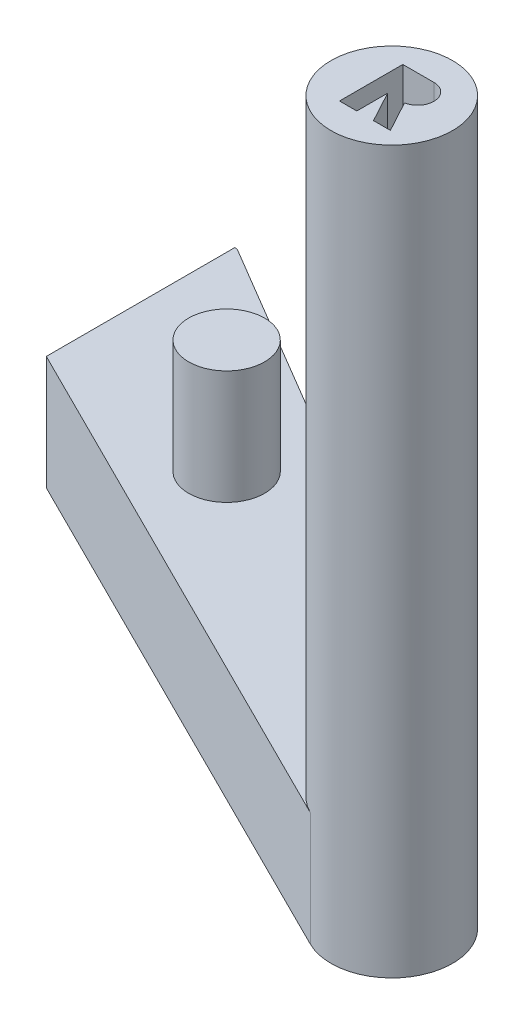
ISO-10303-21;
HEADER;
FILE_DESCRIPTION(('STEP AP214'),'2;1');
FILE_NAME('part.step','',(''),(''),'','','');
FILE_SCHEMA(('AUTOMOTIVE_DESIGN { 1 0 10303 214 1 1 1 1 }'));
ENDSEC;
DATA;
#1=APPLICATION_CONTEXT('core data for automotive mechanical design processes');
#2=APPLICATION_PROTOCOL_DEFINITION('international standard','automotive_design',2000,#1);
#3=PRODUCT_CONTEXT('',#1,'mechanical');
#4=PRODUCT('Part','Part','',(#3));
#5=PRODUCT_RELATED_PRODUCT_CATEGORY('part','',(#4));
#6=PRODUCT_DEFINITION_FORMATION('','',#4);
#7=PRODUCT_DEFINITION_CONTEXT('part definition',#1,'design');
#8=PRODUCT_DEFINITION('design','',#6,#7);
#9=PRODUCT_DEFINITION_SHAPE('','',#8);
#10=(LENGTH_UNIT() NAMED_UNIT(*) SI_UNIT(.MILLI.,.METRE.));
#11=(NAMED_UNIT(*) PLANE_ANGLE_UNIT() SI_UNIT($,.RADIAN.));
#12=(NAMED_UNIT(*) SI_UNIT($,.STERADIAN.) SOLID_ANGLE_UNIT());
#13=UNCERTAINTY_MEASURE_WITH_UNIT(LENGTH_MEASURE(1.E-05),#10,'distance_accuracy_value','');
#14=(GEOMETRIC_REPRESENTATION_CONTEXT(3) GLOBAL_UNCERTAINTY_ASSIGNED_CONTEXT((#13)) GLOBAL_UNIT_ASSIGNED_CONTEXT((#10,
#11,#12)) REPRESENTATION_CONTEXT('',''));
#15=CARTESIAN_POINT('',(0.,0.,0.));
#16=DIRECTION('',(0.,0.,1.));
#17=DIRECTION('',(1.,0.,0.));
#18=AXIS2_PLACEMENT_3D('',#15,#16,#17);
#19=CARTESIAN_POINT('',(0.,95.,0.));
#20=DIRECTION('',(0.,-1.,0.));
#21=DIRECTION('',(0.,0.,-1.));
#22=AXIS2_PLACEMENT_3D('',#19,#20,#21);
#23=CYLINDRICAL_SURFACE('',#22,8.);
#24=CARTESIAN_POINT('',(0.,95.,0.));
#25=DIRECTION('',(0.,1.,0.));
#26=DIRECTION('',(0.,0.,1.));
#27=AXIS2_PLACEMENT_3D('',#24,#25,#26);
#28=CIRCLE('',#27,8.);
#29=CARTESIAN_POINT('',(0.,95.,8.));
#30=VERTEX_POINT('',#29);
#31=EDGE_CURVE('E11',#30,#30,#28,.T.);
#32=ORIENTED_EDGE('',*,*,#31,.F.);
#33=EDGE_LOOP('',(#32));
#34=FACE_BOUND('',#33,.T.);
#35=DIRECTION('',(0.,-1.,0.));
#36=VECTOR('',#35,1.);
#37=CARTESIAN_POINT('',(4.07426175732721,15.,-6.88479419683559));
#38=LINE('',#37,#36);
#39=CARTESIAN_POINT('',(4.07426175732721,15.,-6.88479419683559));
#40=VERTEX_POINT('',#39);
#41=CARTESIAN_POINT('',(4.07426175732721,0.,-6.88479419683559));
#42=VERTEX_POINT('',#41);
#43=EDGE_CURVE('E58',#40,#42,#38,.T.);
#44=ORIENTED_EDGE('',*,*,#43,.F.);
#45=CARTESIAN_POINT('',(0.,15.,0.));
#46=DIRECTION('',(0.,1.,0.));
#47=DIRECTION('',(0.,0.,1.));
#48=AXIS2_PLACEMENT_3D('',#45,#46,#47);
#49=CIRCLE('',#48,8.);
#50=CARTESIAN_POINT('',(-3.57279106032631,15.,7.1578742681925));
#51=VERTEX_POINT('',#50);
#52=EDGE_CURVE('E53',#40,#51,#49,.T.);
#53=ORIENTED_EDGE('',*,*,#52,.T.);
#54=DIRECTION('',(0.,-1.,0.));
#55=VECTOR('',#54,1.);
#56=CARTESIAN_POINT('',(-3.57279106032632,15.,7.15787426819251));
#57=LINE('',#56,#55);
#58=CARTESIAN_POINT('',(-3.57279106032632,0.,7.15787426819251));
#59=VERTEX_POINT('',#58);
#60=EDGE_CURVE('E165',#51,#59,#57,.T.);
#61=ORIENTED_EDGE('',*,*,#60,.T.);
#62=CARTESIAN_POINT('',(0.,0.,0.));
#63=DIRECTION('',(0.,1.,0.));
#64=DIRECTION('',(0.,0.,1.));
#65=AXIS2_PLACEMENT_3D('',#62,#63,#64);
#66=CIRCLE('',#65,8.);
#67=EDGE_CURVE('E42',#59,#42,#66,.T.);
#68=ORIENTED_EDGE('',*,*,#67,.T.);
#69=EDGE_LOOP('',(#44,#53,#61,#68));
#70=FACE_BOUND('',#69,.T.);
#71=ADVANCED_FACE('F39',(#34,#70),#23,.T.);
#72=CARTESIAN_POINT('',(0.,95.,0.));
#73=DIRECTION('',(0.,1.,0.));
#74=DIRECTION('',(0.,0.,1.));
#75=AXIS2_PLACEMENT_3D('',#72,#73,#74);
#76=PLANE('',#75);
#77=ORIENTED_EDGE('',*,*,#31,.T.);
#78=EDGE_LOOP('',(#77));
#79=FACE_BOUND('',#78,.T.);
#80=DIRECTION('',(1.,0.,0.));
#81=VECTOR('',#80,1.);
#82=CARTESIAN_POINT('',(0.,95.,-4.27859742946709));
#83=LINE('',#82,#81);
#84=CARTESIAN_POINT('',(-2.82696370228331,95.,-4.27859742946709));
#85=VERTEX_POINT('',#84);
#86=CARTESIAN_POINT('',(1.2752561078582,95.,-4.27859742946709));
#87=VERTEX_POINT('',#86);
#88=EDGE_CURVE('E210',#85,#87,#83,.T.);
#89=ORIENTED_EDGE('',*,*,#88,.T.);
#90=CARTESIAN_POINT('',(1.2752561078582,95.,-2.1205507819464));
#91=DIRECTION('',(0.,1.,0.));
#92=DIRECTION('',(0.,0.,1.));
#93=AXIS2_PLACEMENT_3D('',#90,#91,#92);
#94=CIRCLE('',#93,2.15804664752069);
#95=CARTESIAN_POINT('',(1.6757928902663,95.,0.));
#96=VERTEX_POINT('',#95);
#97=EDGE_CURVE('E184',#87,#96,#94,.F.);
#98=ORIENTED_EDGE('',*,*,#97,.T.);
#99=DIRECTION('',(0.476392179300963,0.,0.879232899464573));
#100=VECTOR('',#99,1.);
#101=CARTESIAN_POINT('',(1.29547251747404,95.,-0.701922068885038));
#102=LINE('',#101,#100);
#103=CARTESIAN_POINT('',(3.8771620750215,95.,4.06286310985283));
#104=VERTEX_POINT('',#103);
#105=EDGE_CURVE('E189',#96,#104,#102,.T.);
#106=ORIENTED_EDGE('',*,*,#105,.T.);
#107=DIRECTION('',(1.,0.,0.));
#108=VECTOR('',#107,1.);
#109=CARTESIAN_POINT('',(0.,95.,4.06286310985283));
#110=LINE('',#109,#108);
#111=CARTESIAN_POINT('',(1.65372068123101,95.,4.06286310985283));
#112=VERTEX_POINT('',#111);
#113=EDGE_CURVE('E225',#112,#104,#110,.T.);
#114=ORIENTED_EDGE('',*,*,#113,.F.);
#115=DIRECTION('',(0.476392179300963,0.,0.879232899464573));
#116=VECTOR('',#115,1.);
#117=CARTESIAN_POINT('',(-0.423359944819093,95.,0.229387875344432));
#118=LINE('',#117,#116);
#119=CARTESIAN_POINT('',(-0.547648503524186,95.,0.));
#120=VERTEX_POINT('',#119);
#121=EDGE_CURVE('E222',#120,#112,#118,.T.);
#122=ORIENTED_EDGE('',*,*,#121,.F.);
#123=DIRECTION('',(0.,0.,1.));
#124=VECTOR('',#123,1.);
#125=CARTESIAN_POINT('',(-0.547648503524186,95.,0.));
#126=LINE('',#125,#124);
#127=CARTESIAN_POINT('',(-0.547648503524186,95.,4.06286310985283));
#128=VERTEX_POINT('',#127);
#129=EDGE_CURVE('E219',#120,#128,#126,.T.);
#130=ORIENTED_EDGE('',*,*,#129,.T.);
#131=DIRECTION('',(1.,0.,0.));
#132=VECTOR('',#131,1.);
#133=CARTESIAN_POINT('',(0.,95.,4.06286310985283));
#134=LINE('',#133,#132);
#135=CARTESIAN_POINT('',(-2.82696370228331,95.,4.06286310985283));
#136=VERTEX_POINT('',#135);
#137=EDGE_CURVE('E216',#136,#128,#134,.T.);
#138=ORIENTED_EDGE('',*,*,#137,.F.);
#139=DIRECTION('',(0.,0.,1.));
#140=VECTOR('',#139,1.);
#141=CARTESIAN_POINT('',(-2.82696370228331,95.,0.));
#142=LINE('',#141,#140);
#143=EDGE_CURVE('E213',#85,#136,#142,.T.);
#144=ORIENTED_EDGE('',*,*,#143,.F.);
#145=EDGE_LOOP('',(#89,#98,#106,#114,#122,#130,#138,#144));
#146=FACE_BOUND('',#145,.T.);
#147=ADVANCED_FACE('F285',(#79,#146),#76,.T.);
#148=CARTESIAN_POINT('',(0.,0.,0.));
#149=DIRECTION('',(0.,1.,0.));
#150=DIRECTION('',(0.,0.,1.));
#151=AXIS2_PLACEMENT_3D('',#148,#149,#150);
#152=PLANE('',#151);
#153=CARTESIAN_POINT('',(0.,0.,0.));
#154=DIRECTION('',(0.,-1.,0.));
#155=DIRECTION('',(0.,0.,-1.));
#156=AXIS2_PLACEMENT_3D('',#153,#154,#155);
#157=CIRCLE('',#156,4.);
#158=CARTESIAN_POINT('',(0.,0.,-4.));
#159=VERTEX_POINT('',#158);
#160=EDGE_CURVE('E233',#159,#159,#157,.T.);
#161=ORIENTED_EDGE('',*,*,#160,.F.);
#162=EDGE_LOOP('',(#161));
#163=FACE_BOUND('',#162,.T.);
#164=ORIENTED_EDGE('',*,*,#67,.F.);
#165=DIRECTION('',(0.894735513611201,0.,0.446596418125919));
#166=VECTOR('',#165,1.);
#167=CARTESIAN_POINT('',(-3.57277134499381,0.,7.15788410886246));
#168=LINE('',#167,#166);
#169=CARTESIAN_POINT('',(-73.0017361381057,0.,-27.4967445709018));
#170=VERTEX_POINT('',#169);
#171=EDGE_CURVE('E156',#170,#59,#168,.T.);
#172=ORIENTED_EDGE('',*,*,#171,.F.);
#173=DIRECTION('',(0.,0.,1.));
#174=VECTOR('',#173,1.);
#175=CARTESIAN_POINT('',(-73.0017361381057,0.,0.));
#176=LINE('',#175,#174);
#177=CARTESIAN_POINT('',(-73.0017361381057,0.,-52.3357072501549));
#178=VERTEX_POINT('',#177);
#179=EDGE_CURVE('E170',#178,#170,#176,.T.);
#180=ORIENTED_EDGE('',*,*,#179,.F.);
#181=CARTESIAN_POINT('',(-75.0017361381057,0.,-39.9967445709018));
#182=DIRECTION('',(0.,1.,0.));
#183=DIRECTION('',(0.,0.,1.));
#184=AXIS2_PLACEMENT_3D('',#181,#182,#183);
#185=CIRCLE('',#184,12.5);
#186=CARTESIAN_POINT('',(-72.6121958670346,0.,-52.2662228521055));
#187=VERTEX_POINT('',#186);
#188=EDGE_CURVE('E168',#187,#178,#185,.T.);
#189=ORIENTED_EDGE('',*,*,#188,.F.);
#190=DIRECTION('',(0.86059849228556,0.,0.509284041646526));
#191=VECTOR('',#190,1.);
#192=CARTESIAN_POINT('',(4.0742723331674,0.,-6.88478793827636));
#193=LINE('',#192,#191);
#194=EDGE_CURVE('E151',#187,#42,#193,.T.);
#195=ORIENTED_EDGE('',*,*,#194,.T.);
#196=EDGE_LOOP('',(#164,#172,#180,#189,#195));
#197=FACE_BOUND('',#196,.T.);
#198=ADVANCED_FACE('F259',(#163,#197),#152,.F.);
#199=CARTESIAN_POINT('',(0.,45.,0.));
#200=DIRECTION('',(0.,-1.,0.));
#201=DIRECTION('',(0.,0.,-1.));
#202=AXIS2_PLACEMENT_3D('',#199,#200,#201);
#203=CYLINDRICAL_SURFACE('',#202,4.);
#204=CARTESIAN_POINT('',(0.,45.,0.));
#205=DIRECTION('',(0.,1.,0.));
#206=DIRECTION('',(0.,0.,1.));
#207=AXIS2_PLACEMENT_3D('',#204,#205,#206);
#208=CIRCLE('',#207,4.);
#209=CARTESIAN_POINT('',(0.,45.,-4.));
#210=VERTEX_POINT('',#209);
#211=EDGE_CURVE('E142',#210,#210,#208,.F.);
#212=CARTESIAN_POINT('',(0.,45.,-4.));
#213=CARTESIAN_POINT('',(0.,44.53125,-4.));
#214=CARTESIAN_POINT('',(0.,44.0625,-4.));
#215=CARTESIAN_POINT('',(0.,43.125,-4.));
#216=CARTESIAN_POINT('',(0.,42.65625,-4.));
#217=CARTESIAN_POINT('',(0.,41.71875,-4.));
#218=CARTESIAN_POINT('',(0.,41.25,-4.));
#219=CARTESIAN_POINT('',(0.,40.3125,-4.));
#220=CARTESIAN_POINT('',(0.,39.84375,-4.));
#221=CARTESIAN_POINT('',(0.,38.90625,-4.));
#222=CARTESIAN_POINT('',(0.,38.4375,-4.));
#223=CARTESIAN_POINT('',(0.,37.5,-4.));
#224=CARTESIAN_POINT('',(0.,37.03125,-4.));
#225=CARTESIAN_POINT('',(0.,36.09375,-4.));
#226=CARTESIAN_POINT('',(0.,35.625,-4.));
#227=CARTESIAN_POINT('',(0.,34.6875,-4.));
#228=CARTESIAN_POINT('',(0.,34.21875,-4.));
#229=CARTESIAN_POINT('',(0.,33.28125,-4.));
#230=CARTESIAN_POINT('',(0.,32.8125,-4.));
#231=CARTESIAN_POINT('',(0.,31.875,-4.));
#232=CARTESIAN_POINT('',(0.,31.40625,-4.));
#233=CARTESIAN_POINT('',(0.,30.46875,-4.));
#234=CARTESIAN_POINT('',(0.,30.,-4.));
#235=CARTESIAN_POINT('',(0.,29.0625,-4.));
#236=CARTESIAN_POINT('',(0.,28.59375,-4.));
#237=CARTESIAN_POINT('',(0.,27.65625,-4.));
#238=CARTESIAN_POINT('',(0.,27.1875,-4.));
#239=CARTESIAN_POINT('',(0.,26.25,-4.));
#240=CARTESIAN_POINT('',(0.,25.78125,-4.));
#241=CARTESIAN_POINT('',(0.,24.84375,-4.));
#242=CARTESIAN_POINT('',(0.,24.375,-4.));
#243=CARTESIAN_POINT('',(0.,23.4375,-4.));
#244=CARTESIAN_POINT('',(0.,22.96875,-4.));
#245=CARTESIAN_POINT('',(0.,22.03125,-4.));
#246=CARTESIAN_POINT('',(0.,21.5625,-4.));
#247=CARTESIAN_POINT('',(0.,20.625,-4.));
#248=CARTESIAN_POINT('',(0.,20.15625,-4.));
#249=CARTESIAN_POINT('',(0.,19.21875,-4.));
#250=CARTESIAN_POINT('',(0.,18.75,-4.));
#251=CARTESIAN_POINT('',(0.,17.8125,-4.));
#252=CARTESIAN_POINT('',(0.,17.34375,-4.));
#253=CARTESIAN_POINT('',(0.,16.40625,-4.));
#254=CARTESIAN_POINT('',(0.,15.9375,-4.));
#255=CARTESIAN_POINT('',(0.,15.,-4.));
#256=CARTESIAN_POINT('',(0.,14.53125,-4.));
#257=CARTESIAN_POINT('',(0.,13.59375,-4.));
#258=CARTESIAN_POINT('',(0.,13.125,-4.));
#259=CARTESIAN_POINT('',(0.,12.1875,-4.));
#260=CARTESIAN_POINT('',(0.,11.71875,-4.));
#261=CARTESIAN_POINT('',(0.,10.78125,-4.));
#262=CARTESIAN_POINT('',(0.,10.3125,-4.));
#263=CARTESIAN_POINT('',(0.,9.37500000000001,-4.));
#264=CARTESIAN_POINT('',(0.,8.90625000000001,-4.));
#265=CARTESIAN_POINT('',(0.,7.96875000000001,-4.));
#266=CARTESIAN_POINT('',(0.,7.5,-4.));
#267=CARTESIAN_POINT('',(0.,6.5625,-4.));
#268=CARTESIAN_POINT('',(0.,6.09375,-4.));
#269=CARTESIAN_POINT('',(0.,5.15625000000001,-4.));
#270=CARTESIAN_POINT('',(0.,4.68750000000001,-4.));
#271=CARTESIAN_POINT('',(0.,3.75000000000001,-4.));
#272=CARTESIAN_POINT('',(0.,3.28125000000001,-4.));
#273=CARTESIAN_POINT('',(0.,2.34375000000001,-4.));
#274=CARTESIAN_POINT('',(0.,1.87500000000001,-4.));
#275=CARTESIAN_POINT('',(0.,0.937500000000006,-4.));
#276=CARTESIAN_POINT('',(0.,0.468750000000007,-4.));
#277=CARTESIAN_POINT('',(0.,0.,-4.));
#278=B_SPLINE_CURVE_WITH_KNOTS('',3,(#212,#213,#214,#215,#216,#217,#218,#219,#220,#221,#222,
#223,#224,#225,#226,#227,#228,#229,#230,#231,#232,#233,#234,#235,#236,#237,#238,#239,#240,#241,
#242,#243,#244,#245,#246,#247,#248,#249,#250,#251,#252,#253,#254,#255,#256,#257,#258,#259,#260,
#261,#262,#263,#264,#265,#266,#267,#268,#269,#270,#271,#272,#273,#274,#275,#276,#277),
.UNSPECIFIED.,.F.,.F.,(4,2,2,2,2,2,2,2,2,2,2,2,2,2,2,2,2,2,2,2,2,2,2,2,2,2,2,2,2,2,2,2,4),(0.,
1.40625,2.8125,4.21874999999999,5.625,7.03125,8.43749999999999,9.84374999999999,11.25,12.65625,
14.0625,15.46875,16.875,18.28125,19.6875,21.09375,22.5,23.90625,25.3125,26.71875,28.125,
29.53125,30.9375,32.34375,33.75,35.15625,36.5625,37.96875,39.375,40.78125,42.1875,43.59375,45.),.UNSPECIFIED.);
#279=EDGE_CURVE('BSEAM341',#210,#159,#278,.T.);
#280=ORIENTED_EDGE('',*,*,#211,.F.);
#281=ORIENTED_EDGE('',*,*,#160,.T.);
#282=ORIENTED_EDGE('',*,*,#279,.T.);
#283=ORIENTED_EDGE('',*,*,#279,.F.);
#284=EDGE_LOOP('',(#280,#282,#281,#283));
#285=FACE_BOUND('',#284,.T.);
#286=ADVANCED_FACE('F341',(#285),#203,.F.);
#287=CARTESIAN_POINT('',(1.2752561078582,55.,-2.1205507819464));
#288=DIRECTION('',(0.,1.,0.));
#289=DIRECTION('',(0.,0.,1.));
#290=AXIS2_PLACEMENT_3D('',#287,#288,#289);
#291=CYLINDRICAL_SURFACE('',#290,2.15804664752069);
#292=ORIENTED_EDGE('',*,*,#97,.F.);
#293=DIRECTION('',(0.,1.,0.));
#294=VECTOR('',#293,1.);
#295=CARTESIAN_POINT('',(1.2752561078582,55.,-4.27859742946709));
#296=LINE('',#295,#294);
#297=CARTESIAN_POINT('',(1.2752561078582,55.,-4.27859742946709));
#298=VERTEX_POINT('',#297);
#299=EDGE_CURVE('E207',#298,#87,#296,.T.);
#300=ORIENTED_EDGE('',*,*,#299,.F.);
#301=CARTESIAN_POINT('',(1.2752561078582,55.,-2.1205507819464));
#302=DIRECTION('',(0.,1.,0.));
#303=DIRECTION('',(0.,0.,1.));
#304=AXIS2_PLACEMENT_3D('',#301,#302,#303);
#305=CIRCLE('',#304,2.15804664752069);
#306=CARTESIAN_POINT('',(1.6757928902663,55.,0.));
#307=VERTEX_POINT('',#306);
#308=EDGE_CURVE('E185',#298,#307,#305,.F.);
#309=ORIENTED_EDGE('',*,*,#308,.T.);
#310=DIRECTION('',(0.,1.,0.));
#311=VECTOR('',#310,1.);
#312=CARTESIAN_POINT('',(1.6757928902663,55.,0.));
#313=LINE('',#312,#311);
#314=EDGE_CURVE('E230',#307,#96,#313,.T.);
#315=ORIENTED_EDGE('',*,*,#314,.T.);
#316=EDGE_LOOP('',(#292,#300,#309,#315));
#317=FACE_BOUND('',#316,.T.);
#318=ADVANCED_FACE('F303',(#317),#291,.F.);
#319=CARTESIAN_POINT('',(1.29547251747404,55.,-0.701922068885038));
#320=DIRECTION('',(-0.879232899464573,0.,0.476392179300963));
#321=DIRECTION('',(0.476392179300963,0.,0.879232899464573));
#322=AXIS2_PLACEMENT_3D('',#319,#320,#321);
#323=PLANE('',#322);
#324=ORIENTED_EDGE('',*,*,#105,.F.);
#325=ORIENTED_EDGE('',*,*,#314,.F.);
#326=DIRECTION('',(0.476392179300963,0.,0.879232899464573));
#327=VECTOR('',#326,1.);
#328=CARTESIAN_POINT('',(1.29547251747404,55.,-0.701922068885038));
#329=LINE('',#328,#327);
#330=CARTESIAN_POINT('',(3.8771620750215,55.,4.06286310985283));
#331=VERTEX_POINT('',#330);
#332=EDGE_CURVE('E205',#307,#331,#329,.T.);
#333=ORIENTED_EDGE('',*,*,#332,.T.);
#334=DIRECTION('',(0.,1.,0.));
#335=VECTOR('',#334,1.);
#336=CARTESIAN_POINT('',(3.8771620750215,55.,4.06286310985283));
#337=LINE('',#336,#335);
#338=EDGE_CURVE('E234',#331,#104,#337,.T.);
#339=ORIENTED_EDGE('',*,*,#338,.T.);
#340=EDGE_LOOP('',(#324,#325,#333,#339));
#341=FACE_BOUND('',#340,.T.);
#342=ADVANCED_FACE('F311',(#341),#323,.T.);
#343=CARTESIAN_POINT('',(0.,55.,4.06286310985283));
#344=DIRECTION('',(0.,0.,1.));
#345=DIRECTION('',(1.,0.,0.));
#346=AXIS2_PLACEMENT_3D('',#343,#344,#345);
#347=PLANE('',#346);
#348=ORIENTED_EDGE('',*,*,#113,.T.);
#349=ORIENTED_EDGE('',*,*,#338,.F.);
#350=DIRECTION('',(1.,0.,0.));
#351=VECTOR('',#350,1.);
#352=CARTESIAN_POINT('',(0.,55.,4.06286310985283));
#353=LINE('',#352,#351);
#354=CARTESIAN_POINT('',(1.65372068123101,55.,4.06286310985283));
#355=VERTEX_POINT('',#354);
#356=EDGE_CURVE('E202',#355,#331,#353,.T.);
#357=ORIENTED_EDGE('',*,*,#356,.F.);
#358=DIRECTION('',(0.,1.,0.));
#359=VECTOR('',#358,1.);
#360=CARTESIAN_POINT('',(1.65372068123101,55.,4.06286310985283));
#361=LINE('',#360,#359);
#362=EDGE_CURVE('E236',#355,#112,#361,.T.);
#363=ORIENTED_EDGE('',*,*,#362,.T.);
#364=EDGE_LOOP('',(#348,#349,#357,#363));
#365=FACE_BOUND('',#364,.T.);
#366=ADVANCED_FACE('F313',(#365),#347,.F.);
#367=CARTESIAN_POINT('',(-0.423359944819093,55.,0.229387875344432));
#368=DIRECTION('',(-0.879232899464573,0.,0.476392179300963));
#369=DIRECTION('',(0.476392179300963,0.,0.879232899464573));
#370=AXIS2_PLACEMENT_3D('',#367,#368,#369);
#371=PLANE('',#370);
#372=ORIENTED_EDGE('',*,*,#121,.T.);
#373=ORIENTED_EDGE('',*,*,#362,.F.);
#374=DIRECTION('',(0.476392179300963,0.,0.879232899464573));
#375=VECTOR('',#374,1.);
#376=CARTESIAN_POINT('',(-0.423359944819093,55.,0.229387875344432));
#377=LINE('',#376,#375);
#378=CARTESIAN_POINT('',(-0.547648503524186,55.,0.));
#379=VERTEX_POINT('',#378);
#380=EDGE_CURVE('E199',#379,#355,#377,.T.);
#381=ORIENTED_EDGE('',*,*,#380,.F.);
#382=DIRECTION('',(0.,1.,0.));
#383=VECTOR('',#382,1.);
#384=CARTESIAN_POINT('',(-0.547648503524186,55.,0.));
#385=LINE('',#384,#383);
#386=EDGE_CURVE('E238',#379,#120,#385,.T.);
#387=ORIENTED_EDGE('',*,*,#386,.T.);
#388=EDGE_LOOP('',(#372,#373,#381,#387));
#389=FACE_BOUND('',#388,.T.);
#390=ADVANCED_FACE('F318',(#389),#371,.F.);
#391=CARTESIAN_POINT('',(-0.547648503524186,55.,0.));
#392=DIRECTION('',(-1.,0.,0.));
#393=DIRECTION('',(0.,0.,1.));
#394=AXIS2_PLACEMENT_3D('',#391,#392,#393);
#395=PLANE('',#394);
#396=ORIENTED_EDGE('',*,*,#129,.F.);
#397=ORIENTED_EDGE('',*,*,#386,.F.);
#398=DIRECTION('',(0.,0.,1.));
#399=VECTOR('',#398,1.);
#400=CARTESIAN_POINT('',(-0.547648503524186,55.,0.));
#401=LINE('',#400,#399);
#402=CARTESIAN_POINT('',(-0.547648503524186,55.,4.06286310985283));
#403=VERTEX_POINT('',#402);
#404=EDGE_CURVE('E197',#379,#403,#401,.T.);
#405=ORIENTED_EDGE('',*,*,#404,.T.);
#406=DIRECTION('',(0.,1.,0.));
#407=VECTOR('',#406,1.);
#408=CARTESIAN_POINT('',(-0.547648503524186,55.,4.06286310985283));
#409=LINE('',#408,#407);
#410=EDGE_CURVE('E240',#403,#128,#409,.T.);
#411=ORIENTED_EDGE('',*,*,#410,.T.);
#412=EDGE_LOOP('',(#396,#397,#405,#411));
#413=FACE_BOUND('',#412,.T.);
#414=ADVANCED_FACE('F322',(#413),#395,.T.);
#415=CARTESIAN_POINT('',(0.,55.,4.06286310985283));
#416=DIRECTION('',(0.,0.,1.));
#417=DIRECTION('',(1.,0.,0.));
#418=AXIS2_PLACEMENT_3D('',#415,#416,#417);
#419=PLANE('',#418);
#420=ORIENTED_EDGE('',*,*,#137,.T.);
#421=ORIENTED_EDGE('',*,*,#410,.F.);
#422=DIRECTION('',(1.,0.,0.));
#423=VECTOR('',#422,1.);
#424=CARTESIAN_POINT('',(0.,55.,4.06286310985283));
#425=LINE('',#424,#423);
#426=CARTESIAN_POINT('',(-2.82696370228331,55.,4.06286310985283));
#427=VERTEX_POINT('',#426);
#428=EDGE_CURVE('E194',#427,#403,#425,.T.);
#429=ORIENTED_EDGE('',*,*,#428,.F.);
#430=DIRECTION('',(0.,1.,0.));
#431=VECTOR('',#430,1.);
#432=CARTESIAN_POINT('',(-2.82696370228331,55.,4.06286310985283));
#433=LINE('',#432,#431);
#434=EDGE_CURVE('E242',#427,#136,#433,.T.);
#435=ORIENTED_EDGE('',*,*,#434,.T.);
#436=EDGE_LOOP('',(#420,#421,#429,#435));
#437=FACE_BOUND('',#436,.T.);
#438=ADVANCED_FACE('F326',(#437),#419,.F.);
#439=CARTESIAN_POINT('',(-2.82696370228331,55.,0.));
#440=DIRECTION('',(-1.,0.,0.));
#441=DIRECTION('',(0.,0.,1.));
#442=AXIS2_PLACEMENT_3D('',#439,#440,#441);
#443=PLANE('',#442);
#444=ORIENTED_EDGE('',*,*,#143,.T.);
#445=ORIENTED_EDGE('',*,*,#434,.F.);
#446=DIRECTION('',(0.,0.,1.));
#447=VECTOR('',#446,1.);
#448=CARTESIAN_POINT('',(-2.82696370228331,55.,0.));
#449=LINE('',#448,#447);
#450=CARTESIAN_POINT('',(-2.82696370228331,55.,-4.27859742946709));
#451=VERTEX_POINT('',#450);
#452=EDGE_CURVE('E191',#451,#427,#449,.T.);
#453=ORIENTED_EDGE('',*,*,#452,.F.);
#454=DIRECTION('',(0.,1.,0.));
#455=VECTOR('',#454,1.);
#456=CARTESIAN_POINT('',(-2.82696370228331,55.,-4.27859742946709));
#457=LINE('',#456,#455);
#458=EDGE_CURVE('E244',#451,#85,#457,.T.);
#459=ORIENTED_EDGE('',*,*,#458,.T.);
#460=EDGE_LOOP('',(#444,#445,#453,#459));
#461=FACE_BOUND('',#460,.T.);
#462=ADVANCED_FACE('F328',(#461),#443,.F.);
#463=CARTESIAN_POINT('',(0.,55.,-4.27859742946709));
#464=DIRECTION('',(0.,0.,1.));
#465=DIRECTION('',(1.,0.,0.));
#466=AXIS2_PLACEMENT_3D('',#463,#464,#465);
#467=PLANE('',#466);
#468=ORIENTED_EDGE('',*,*,#88,.F.);
#469=ORIENTED_EDGE('',*,*,#458,.F.);
#470=DIRECTION('',(1.,0.,0.));
#471=VECTOR('',#470,1.);
#472=CARTESIAN_POINT('',(0.,55.,-4.27859742946709));
#473=LINE('',#472,#471);
#474=EDGE_CURVE('E188',#451,#298,#473,.T.);
#475=ORIENTED_EDGE('',*,*,#474,.T.);
#476=ORIENTED_EDGE('',*,*,#299,.T.);
#477=EDGE_LOOP('',(#468,#469,#475,#476));
#478=FACE_BOUND('',#477,.T.);
#479=ADVANCED_FACE('F298',(#478),#467,.T.);
#480=CARTESIAN_POINT('',(0.,55.,0.));
#481=DIRECTION('',(0.,1.,0.));
#482=DIRECTION('',(0.,0.,1.));
#483=AXIS2_PLACEMENT_3D('',#480,#481,#482);
#484=PLANE('',#483);
#485=ORIENTED_EDGE('',*,*,#308,.F.);
#486=ORIENTED_EDGE('',*,*,#474,.F.);
#487=ORIENTED_EDGE('',*,*,#452,.T.);
#488=ORIENTED_EDGE('',*,*,#428,.T.);
#489=ORIENTED_EDGE('',*,*,#404,.F.);
#490=ORIENTED_EDGE('',*,*,#380,.T.);
#491=ORIENTED_EDGE('',*,*,#356,.T.);
#492=ORIENTED_EDGE('',*,*,#332,.F.);
#493=EDGE_LOOP('',(#485,#486,#487,#488,#489,#490,#491,#492));
#494=FACE_BOUND('',#493,.T.);
#495=ADVANCED_FACE('F306',(#494),#484,.T.);
#496=CARTESIAN_POINT('',(4.0742723331674,15.,-6.88478793827636));
#497=DIRECTION('',(0.509284041646526,0.,-0.86059849228556));
#498=DIRECTION('',(-0.86059849228556,0.,-0.509284041646526));
#499=AXIS2_PLACEMENT_3D('',#496,#497,#498);
#500=PLANE('',#499);
#501=ORIENTED_EDGE('',*,*,#194,.F.);
#502=DIRECTION('',(0.,-1.,0.));
#503=VECTOR('',#502,1.);
#504=CARTESIAN_POINT('',(-72.6121958670346,15.,-52.2662228521055));
#505=LINE('',#504,#503);
#506=CARTESIAN_POINT('',(-72.6121958670346,15.,-52.2662228521055));
#507=VERTEX_POINT('',#506);
#508=EDGE_CURVE('E181',#507,#187,#505,.T.);
#509=ORIENTED_EDGE('',*,*,#508,.F.);
#510=DIRECTION('',(0.86059849228556,0.,0.509284041646526));
#511=VECTOR('',#510,1.);
#512=CARTESIAN_POINT('',(4.0742723331674,15.,-6.88478793827636));
#513=LINE('',#512,#511);
#514=EDGE_CURVE('E155',#507,#40,#513,.T.);
#515=ORIENTED_EDGE('',*,*,#514,.T.);
#516=ORIENTED_EDGE('',*,*,#43,.T.);
#517=EDGE_LOOP('',(#501,#509,#515,#516));
#518=FACE_BOUND('',#517,.T.);
#519=ADVANCED_FACE('F256',(#518),#500,.T.);
#520=CARTESIAN_POINT('',(-75.0017361381057,15.,-39.9967445709018));
#521=DIRECTION('',(0.,-1.,0.));
#522=DIRECTION('',(0.,0.,-1.));
#523=AXIS2_PLACEMENT_3D('',#520,#521,#522);
#524=CYLINDRICAL_SURFACE('',#523,12.5);
#525=ORIENTED_EDGE('',*,*,#188,.T.);
#526=DIRECTION('',(0.,-1.,0.));
#527=VECTOR('',#526,1.);
#528=CARTESIAN_POINT('',(-73.0017361381057,15.,-52.3357072501549));
#529=LINE('',#528,#527);
#530=CARTESIAN_POINT('',(-73.0017361381057,15.,-52.3357072501549));
#531=VERTEX_POINT('',#530);
#532=EDGE_CURVE('E178',#531,#178,#529,.T.);
#533=ORIENTED_EDGE('',*,*,#532,.F.);
#534=CARTESIAN_POINT('',(-75.0017361381057,15.,-39.9967445709018));
#535=DIRECTION('',(0.,1.,0.));
#536=DIRECTION('',(0.,0.,1.));
#537=AXIS2_PLACEMENT_3D('',#534,#535,#536);
#538=CIRCLE('',#537,12.5);
#539=EDGE_CURVE('E159',#507,#531,#538,.T.);
#540=ORIENTED_EDGE('',*,*,#539,.F.);
#541=ORIENTED_EDGE('',*,*,#508,.T.);
#542=EDGE_LOOP('',(#525,#533,#540,#541));
#543=FACE_BOUND('',#542,.T.);
#544=ADVANCED_FACE('F263',(#543),#524,.T.);
#545=CARTESIAN_POINT('',(-73.0017361381057,15.,0.));
#546=DIRECTION('',(1.,0.,0.));
#547=DIRECTION('',(0.,0.,-1.));
#548=AXIS2_PLACEMENT_3D('',#545,#546,#547);
#549=PLANE('',#548);
#550=ORIENTED_EDGE('',*,*,#179,.T.);
#551=DIRECTION('',(0.,-1.,0.));
#552=VECTOR('',#551,1.);
#553=CARTESIAN_POINT('',(-73.0017361381057,15.,-27.4967445709018));
#554=LINE('',#553,#552);
#555=CARTESIAN_POINT('',(-73.0017361381057,15.,-27.4967445709018));
#556=VERTEX_POINT('',#555);
#557=EDGE_CURVE('E175',#556,#170,#554,.T.);
#558=ORIENTED_EDGE('',*,*,#557,.F.);
#559=DIRECTION('',(0.,0.,1.));
#560=VECTOR('',#559,1.);
#561=CARTESIAN_POINT('',(-73.0017361381057,15.,0.));
#562=LINE('',#561,#560);
#563=EDGE_CURVE('E161',#531,#556,#562,.T.);
#564=ORIENTED_EDGE('',*,*,#563,.F.);
#565=ORIENTED_EDGE('',*,*,#532,.T.);
#566=EDGE_LOOP('',(#550,#558,#564,#565));
#567=FACE_BOUND('',#566,.T.);
#568=ADVANCED_FACE('F267',(#567),#549,.F.);
#569=CARTESIAN_POINT('',(-3.57277134499381,15.,7.15788410886246));
#570=DIRECTION('',(0.446596418125919,0.,-0.894735513611201));
#571=DIRECTION('',(-0.894735513611201,0.,-0.446596418125919));
#572=AXIS2_PLACEMENT_3D('',#569,#570,#571);
#573=PLANE('',#572);
#574=ORIENTED_EDGE('',*,*,#171,.T.);
#575=ORIENTED_EDGE('',*,*,#60,.F.);
#576=DIRECTION('',(0.894735513611201,0.,0.446596418125919));
#577=VECTOR('',#576,1.);
#578=CARTESIAN_POINT('',(-3.57277134499381,15.,7.15788410886246));
#579=LINE('',#578,#577);
#580=EDGE_CURVE('E163',#556,#51,#579,.T.);
#581=ORIENTED_EDGE('',*,*,#580,.F.);
#582=ORIENTED_EDGE('',*,*,#557,.T.);
#583=EDGE_LOOP('',(#574,#575,#581,#582));
#584=FACE_BOUND('',#583,.T.);
#585=ADVANCED_FACE('F273',(#584),#573,.F.);
#586=CARTESIAN_POINT('',(0.,15.,0.));
#587=DIRECTION('',(0.,1.,0.));
#588=DIRECTION('',(0.,0.,1.));
#589=AXIS2_PLACEMENT_3D('',#586,#587,#588);
#590=PLANE('',#589);
#591=CARTESIAN_POINT('',(-48.0017361381057,15.,-26.2466106307581));
#592=DIRECTION('',(0.,1.,0.));
#593=DIRECTION('',(0.,0.,1.));
#594=AXIS2_PLACEMENT_3D('',#591,#592,#593);
#595=CIRCLE('',#594,5.);
#596=CARTESIAN_POINT('',(-48.0017361381057,15.,-21.2466106307581));
#597=VERTEX_POINT('',#596);
#598=EDGE_CURVE('E145',#597,#597,#595,.T.);
#599=ORIENTED_EDGE('',*,*,#598,.F.);
#600=EDGE_LOOP('',(#599));
#601=FACE_BOUND('',#600,.T.);
#602=ORIENTED_EDGE('',*,*,#52,.F.);
#603=ORIENTED_EDGE('',*,*,#514,.F.);
#604=ORIENTED_EDGE('',*,*,#539,.T.);
#605=ORIENTED_EDGE('',*,*,#563,.T.);
#606=ORIENTED_EDGE('',*,*,#580,.T.);
#607=EDGE_LOOP('',(#602,#603,#604,#605,#606));
#608=FACE_BOUND('',#607,.T.);
#609=ADVANCED_FACE('F271',(#601,#608),#590,.T.);
#610=CARTESIAN_POINT('',(-48.0017361381057,30.,-26.2466106307581));
#611=DIRECTION('',(0.,-1.,0.));
#612=DIRECTION('',(0.,0.,-1.));
#613=AXIS2_PLACEMENT_3D('',#610,#611,#612);
#614=CYLINDRICAL_SURFACE('',#613,5.);
#615=CARTESIAN_POINT('',(-48.0017361381057,30.,-26.2466106307581));
#616=DIRECTION('',(0.,1.,0.));
#617=DIRECTION('',(0.,0.,1.));
#618=AXIS2_PLACEMENT_3D('',#615,#616,#617);
#619=CIRCLE('',#618,5.);
#620=CARTESIAN_POINT('',(-48.0017361381057,30.,-21.2466106307581));
#621=VERTEX_POINT('',#620);
#622=EDGE_CURVE('E148',#621,#621,#619,.T.);
#623=ORIENTED_EDGE('',*,*,#622,.F.);
#624=EDGE_LOOP('',(#623));
#625=FACE_BOUND('',#624,.T.);
#626=ORIENTED_EDGE('',*,*,#598,.T.);
#627=EDGE_LOOP('',(#626));
#628=FACE_BOUND('',#627,.T.);
#629=ADVANCED_FACE('F280',(#625,#628),#614,.T.);
#630=CARTESIAN_POINT('',(-48.0017361381057,30.,-26.2466106307581));
#631=DIRECTION('',(0.,1.,0.));
#632=DIRECTION('',(0.,0.,1.));
#633=AXIS2_PLACEMENT_3D('',#630,#631,#632);
#634=PLANE('',#633);
#635=ORIENTED_EDGE('',*,*,#622,.T.);
#636=EDGE_LOOP('',(#635));
#637=FACE_BOUND('',#636,.T.);
#638=ADVANCED_FACE('F460',(#637),#634,.T.);
#639=CARTESIAN_POINT('',(0.,45.,0.));
#640=DIRECTION('',(0.,1.,0.));
#641=DIRECTION('',(0.,0.,1.));
#642=AXIS2_PLACEMENT_3D('',#639,#640,#641);
#643=PLANE('',#642);
#644=CARTESIAN_POINT('',(0.,45.,0.));
#645=DIRECTION('',(0.,1.,0.));
#646=DIRECTION('',(0.,0.,1.));
#647=AXIS2_PLACEMENT_3D('',#644,#645,#646);
#648=CIRCLE('',#647,4.16636162515374);
#649=CARTESIAN_POINT('',(0.,45.,4.16636162515374));
#650=VERTEX_POINT('',#649);
#651=EDGE_CURVE('E140',#650,#650,#648,.T.);
#652=ORIENTED_EDGE('',*,*,#651,.T.);
#653=EDGE_LOOP('',(#652));
#654=FACE_BOUND('',#653,.T.);
#655=ORIENTED_EDGE('',*,*,#211,.T.);
#656=EDGE_LOOP('',(#655));
#657=FACE_BOUND('',#656,.T.);
#658=ADVANCED_FACE('F136',(#654,#657),#643,.T.);
#659=CARTESIAN_POINT('',(0.,45.,0.));
#660=DIRECTION('',(0.,-1.,0.));
#661=DIRECTION('',(0.,0.,-1.));
#662=AXIS2_PLACEMENT_3D('',#659,#660,#661);
#663=CONICAL_SURFACE('',#662,4.16636162515374,0.523598775598293);
#664=CARTESIAN_POINT('',(0.,52.2163500174716,0.));
#665=VERTEX_POINT('',#664);
#666=VERTEX_LOOP('',#665);
#667=FACE_BOUND('',#666,.T.);
#668=ORIENTED_EDGE('',*,*,#651,.F.);
#669=EDGE_LOOP('',(#668));
#670=FACE_BOUND('',#669,.T.);
#671=ADVANCED_FACE('F133',(#667,#670),#663,.F.);
#672=CLOSED_SHELL('',(#71,#147,#198,#286,#318,#342,#366,#390,#414,#438,#462,#479,#495,#519,#544,
#568,#585,#609,#629,#638,#658,#671));
#673=MANIFOLD_SOLID_BREP('B2',#672);
#674=ADVANCED_BREP_SHAPE_REPRESENTATION('',(#18,#673),#14);
#675=SHAPE_DEFINITION_REPRESENTATION(#9,#674);
ENDSEC;
END-ISO-10303-21;
